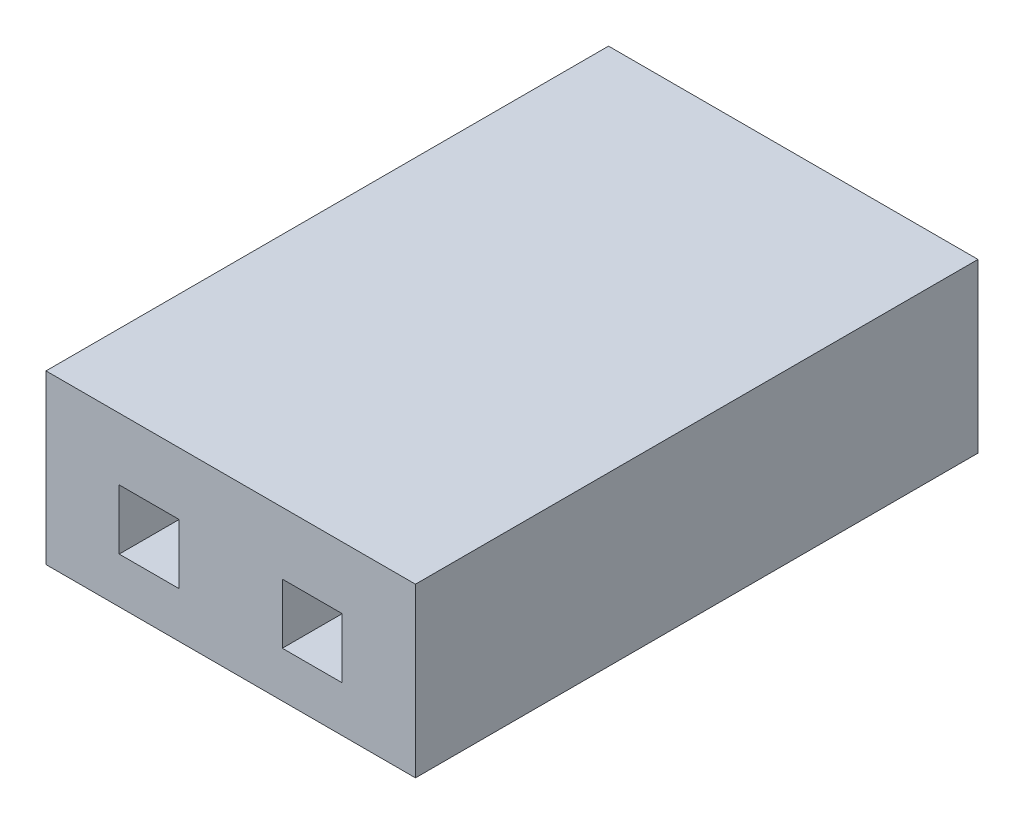
ISO-10303-21;
HEADER;
FILE_DESCRIPTION(('STEP AP214'),'2;1');
FILE_NAME('part.step','',(''),(''),'','','');
FILE_SCHEMA(('AUTOMOTIVE_DESIGN { 1 0 10303 214 1 1 1 1 }'));
ENDSEC;
DATA;
#1=APPLICATION_CONTEXT('core data for automotive mechanical design processes');
#2=APPLICATION_PROTOCOL_DEFINITION('international standard','automotive_design',2000,#1);
#3=PRODUCT_CONTEXT('',#1,'mechanical');
#4=PRODUCT('Part','Part','',(#3));
#5=PRODUCT_RELATED_PRODUCT_CATEGORY('part','',(#4));
#6=PRODUCT_DEFINITION_FORMATION('','',#4);
#7=PRODUCT_DEFINITION_CONTEXT('part definition',#1,'design');
#8=PRODUCT_DEFINITION('design','',#6,#7);
#9=PRODUCT_DEFINITION_SHAPE('','',#8);
#10=(LENGTH_UNIT() NAMED_UNIT(*) SI_UNIT(.MILLI.,.METRE.));
#11=(NAMED_UNIT(*) PLANE_ANGLE_UNIT() SI_UNIT($,.RADIAN.));
#12=(NAMED_UNIT(*) SI_UNIT($,.STERADIAN.) SOLID_ANGLE_UNIT());
#13=UNCERTAINTY_MEASURE_WITH_UNIT(LENGTH_MEASURE(1.E-05),#10,'distance_accuracy_value','');
#14=(GEOMETRIC_REPRESENTATION_CONTEXT(3) GLOBAL_UNCERTAINTY_ASSIGNED_CONTEXT((#13)) GLOBAL_UNIT_ASSIGNED_CONTEXT((#10,
#11,#12)) REPRESENTATION_CONTEXT('',''));
#15=CARTESIAN_POINT('',(0.,0.,0.));
#16=DIRECTION('',(0.,0.,1.));
#17=DIRECTION('',(1.,0.,0.));
#18=AXIS2_PLACEMENT_3D('',#15,#16,#17);
#19=CARTESIAN_POINT('',(2.775,-1.26,8.45));
#20=DIRECTION('',(-1.,0.,0.));
#21=DIRECTION('',(0.,0.,1.));
#22=AXIS2_PLACEMENT_3D('',#19,#20,#21);
#23=PLANE('',#22);
#24=DIRECTION('',(0.,1.,0.));
#25=VECTOR('',#24,1.);
#26=CARTESIAN_POINT('',(2.775,-1.26,0.));
#27=LINE('',#26,#25);
#28=CARTESIAN_POINT('',(2.775,-1.26,0.));
#29=VERTEX_POINT('',#28);
#30=CARTESIAN_POINT('',(2.775,1.26,0.));
#31=VERTEX_POINT('',#30);
#32=EDGE_CURVE('E185',#29,#31,#27,.T.);
#33=ORIENTED_EDGE('',*,*,#32,.T.);
#34=DIRECTION('',(0.,0.,-1.));
#35=VECTOR('',#34,1.);
#36=CARTESIAN_POINT('',(2.775,1.26,8.45));
#37=LINE('',#36,#35);
#38=CARTESIAN_POINT('',(2.775,1.26,8.45));
#39=VERTEX_POINT('',#38);
#40=EDGE_CURVE('E11',#39,#31,#37,.T.);
#41=ORIENTED_EDGE('',*,*,#40,.F.);
#42=DIRECTION('',(0.,1.,0.));
#43=VECTOR('',#42,1.);
#44=CARTESIAN_POINT('',(2.775,-1.26,8.45));
#45=LINE('',#44,#43);
#46=CARTESIAN_POINT('',(2.775,-1.26,8.45));
#47=VERTEX_POINT('',#46);
#48=EDGE_CURVE('E191',#47,#39,#45,.T.);
#49=ORIENTED_EDGE('',*,*,#48,.F.);
#50=DIRECTION('',(0.,0.,-1.));
#51=VECTOR('',#50,1.);
#52=CARTESIAN_POINT('',(2.775,-1.26,8.45));
#53=LINE('',#52,#51);
#54=EDGE_CURVE('E201',#47,#29,#53,.T.);
#55=ORIENTED_EDGE('',*,*,#54,.T.);
#56=EDGE_LOOP('',(#33,#41,#49,#55));
#57=FACE_BOUND('',#56,.T.);
#58=ADVANCED_FACE('F34',(#57),#23,.F.);
#59=CARTESIAN_POINT('',(-2.775,1.26,8.45));
#60=DIRECTION('',(0.,-1.,0.));
#61=DIRECTION('',(0.,0.,-1.));
#62=AXIS2_PLACEMENT_3D('',#59,#60,#61);
#63=PLANE('',#62);
#64=DIRECTION('',(-1.,0.,0.));
#65=VECTOR('',#64,1.);
#66=CARTESIAN_POINT('',(-2.775,1.26,0.));
#67=LINE('',#66,#65);
#68=CARTESIAN_POINT('',(-2.775,1.26,0.));
#69=VERTEX_POINT('',#68);
#70=EDGE_CURVE('E204',#31,#69,#67,.T.);
#71=ORIENTED_EDGE('',*,*,#70,.T.);
#72=DIRECTION('',(0.,0.,-1.));
#73=VECTOR('',#72,1.);
#74=CARTESIAN_POINT('',(-2.775,1.26,8.45));
#75=LINE('',#74,#73);
#76=CARTESIAN_POINT('',(-2.775,1.26,8.45));
#77=VERTEX_POINT('',#76);
#78=EDGE_CURVE('E41',#77,#69,#75,.T.);
#79=ORIENTED_EDGE('',*,*,#78,.F.);
#80=DIRECTION('',(-1.,0.,0.));
#81=VECTOR('',#80,1.);
#82=CARTESIAN_POINT('',(-2.775,1.26,8.45));
#83=LINE('',#82,#81);
#84=EDGE_CURVE('E194',#39,#77,#83,.T.);
#85=ORIENTED_EDGE('',*,*,#84,.F.);
#86=ORIENTED_EDGE('',*,*,#40,.T.);
#87=EDGE_LOOP('',(#71,#79,#85,#86));
#88=FACE_BOUND('',#87,.T.);
#89=ADVANCED_FACE('F234',(#88),#63,.F.);
#90=CARTESIAN_POINT('',(-2.775,-1.26,8.45));
#91=DIRECTION('',(1.,0.,0.));
#92=DIRECTION('',(0.,0.,-1.));
#93=AXIS2_PLACEMENT_3D('',#90,#91,#92);
#94=PLANE('',#93);
#95=DIRECTION('',(0.,-1.,0.));
#96=VECTOR('',#95,1.);
#97=CARTESIAN_POINT('',(-2.775,-1.26,0.));
#98=LINE('',#97,#96);
#99=CARTESIAN_POINT('',(-2.775,-1.26,0.));
#100=VERTEX_POINT('',#99);
#101=EDGE_CURVE('E206',#69,#100,#98,.T.);
#102=ORIENTED_EDGE('',*,*,#101,.T.);
#103=DIRECTION('',(0.,0.,-1.));
#104=VECTOR('',#103,1.);
#105=CARTESIAN_POINT('',(-2.775,-1.26,8.45));
#106=LINE('',#105,#104);
#107=CARTESIAN_POINT('',(-2.775,-1.26,8.45));
#108=VERTEX_POINT('',#107);
#109=EDGE_CURVE('E211',#108,#100,#106,.T.);
#110=ORIENTED_EDGE('',*,*,#109,.F.);
#111=DIRECTION('',(0.,-1.,0.));
#112=VECTOR('',#111,1.);
#113=CARTESIAN_POINT('',(-2.775,-1.26,8.45));
#114=LINE('',#113,#112);
#115=EDGE_CURVE('E197',#77,#108,#114,.T.);
#116=ORIENTED_EDGE('',*,*,#115,.F.);
#117=ORIENTED_EDGE('',*,*,#78,.T.);
#118=EDGE_LOOP('',(#102,#110,#116,#117));
#119=FACE_BOUND('',#118,.T.);
#120=ADVANCED_FACE('F218',(#119),#94,.F.);
#121=CARTESIAN_POINT('',(-2.775,-1.26,8.45));
#122=DIRECTION('',(0.,1.,0.));
#123=DIRECTION('',(0.,0.,1.));
#124=AXIS2_PLACEMENT_3D('',#121,#122,#123);
#125=PLANE('',#124);
#126=DIRECTION('',(1.,0.,0.));
#127=VECTOR('',#126,1.);
#128=CARTESIAN_POINT('',(-2.775,-1.26,0.));
#129=LINE('',#128,#127);
#130=EDGE_CURVE('E195',#100,#29,#129,.T.);
#131=ORIENTED_EDGE('',*,*,#130,.T.);
#132=ORIENTED_EDGE('',*,*,#54,.F.);
#133=DIRECTION('',(1.,0.,0.));
#134=VECTOR('',#133,1.);
#135=CARTESIAN_POINT('',(-2.775,-1.26,8.45));
#136=LINE('',#135,#134);
#137=EDGE_CURVE('E199',#108,#47,#136,.T.);
#138=ORIENTED_EDGE('',*,*,#137,.F.);
#139=ORIENTED_EDGE('',*,*,#109,.T.);
#140=EDGE_LOOP('',(#131,#132,#138,#139));
#141=FACE_BOUND('',#140,.T.);
#142=ADVANCED_FACE('F227',(#141),#125,.F.);
#143=CARTESIAN_POINT('',(0.,0.,8.45));
#144=DIRECTION('',(0.,0.,-1.));
#145=DIRECTION('',(-1.,0.,0.));
#146=AXIS2_PLACEMENT_3D('',#143,#144,#145);
#147=PLANE('',#146);
#148=DIRECTION('',(-1.,0.,0.));
#149=VECTOR('',#148,1.);
#150=CARTESIAN_POINT('',(-1.675,0.326600635830232,8.45));
#151=LINE('',#150,#149);
#152=CARTESIAN_POINT('',(-0.774999999999999,0.326600635830232,8.45));
#153=VERTEX_POINT('',#152);
#154=CARTESIAN_POINT('',(-1.675,0.326600635830232,8.45));
#155=VERTEX_POINT('',#154);
#156=EDGE_CURVE('E151',#153,#155,#151,.T.);
#157=ORIENTED_EDGE('',*,*,#156,.F.);
#158=DIRECTION('',(0.,1.,0.));
#159=VECTOR('',#158,1.);
#160=CARTESIAN_POINT('',(-0.774999999999999,-0.573399364169768,8.45));
#161=LINE('',#160,#159);
#162=CARTESIAN_POINT('',(-0.774999999999999,-0.573399364169768,8.45));
#163=VERTEX_POINT('',#162);
#164=EDGE_CURVE('E48',#163,#153,#161,.T.);
#165=ORIENTED_EDGE('',*,*,#164,.F.);
#166=DIRECTION('',(1.,0.,0.));
#167=VECTOR('',#166,1.);
#168=CARTESIAN_POINT('',(-1.675,-0.573399364169768,8.45));
#169=LINE('',#168,#167);
#170=CARTESIAN_POINT('',(-1.675,-0.573399364169768,8.45));
#171=VERTEX_POINT('',#170);
#172=EDGE_CURVE('E142',#171,#163,#169,.T.);
#173=ORIENTED_EDGE('',*,*,#172,.F.);
#174=DIRECTION('',(0.,-1.,0.));
#175=VECTOR('',#174,1.);
#176=CARTESIAN_POINT('',(-1.675,-0.573399364169768,8.45));
#177=LINE('',#176,#175);
#178=EDGE_CURVE('E145',#155,#171,#177,.T.);
#179=ORIENTED_EDGE('',*,*,#178,.F.);
#180=EDGE_LOOP('',(#157,#165,#173,#179));
#181=FACE_BOUND('',#180,.T.);
#182=DIRECTION('',(-1.,0.,0.));
#183=VECTOR('',#182,1.);
#184=CARTESIAN_POINT('',(0.775000000000001,0.326600635830232,8.45));
#185=LINE('',#184,#183);
#186=CARTESIAN_POINT('',(1.675,0.326600635830232,8.45));
#187=VERTEX_POINT('',#186);
#188=CARTESIAN_POINT('',(0.775000000000001,0.326600635830232,8.45));
#189=VERTEX_POINT('',#188);
#190=EDGE_CURVE('E175',#187,#189,#185,.T.);
#191=ORIENTED_EDGE('',*,*,#190,.F.);
#192=DIRECTION('',(0.,1.,0.));
#193=VECTOR('',#192,1.);
#194=CARTESIAN_POINT('',(1.675,-0.573399364169768,8.45));
#195=LINE('',#194,#193);
#196=CARTESIAN_POINT('',(1.675,-0.573399364169768,8.45));
#197=VERTEX_POINT('',#196);
#198=EDGE_CURVE('E56',#197,#187,#195,.T.);
#199=ORIENTED_EDGE('',*,*,#198,.F.);
#200=DIRECTION('',(1.,0.,0.));
#201=VECTOR('',#200,1.);
#202=CARTESIAN_POINT('',(0.775000000000001,-0.573399364169768,8.45));
#203=LINE('',#202,#201);
#204=CARTESIAN_POINT('',(0.775000000000001,-0.573399364169768,8.45));
#205=VERTEX_POINT('',#204);
#206=EDGE_CURVE('E164',#205,#197,#203,.T.);
#207=ORIENTED_EDGE('',*,*,#206,.F.);
#208=DIRECTION('',(0.,-1.,0.));
#209=VECTOR('',#208,1.);
#210=CARTESIAN_POINT('',(0.775000000000001,-0.573399364169768,8.45));
#211=LINE('',#210,#209);
#212=EDGE_CURVE('E178',#189,#205,#211,.T.);
#213=ORIENTED_EDGE('',*,*,#212,.F.);
#214=EDGE_LOOP('',(#191,#199,#207,#213));
#215=FACE_BOUND('',#214,.T.);
#216=ORIENTED_EDGE('',*,*,#48,.T.);
#217=ORIENTED_EDGE('',*,*,#84,.T.);
#218=ORIENTED_EDGE('',*,*,#115,.T.);
#219=ORIENTED_EDGE('',*,*,#137,.T.);
#220=EDGE_LOOP('',(#216,#217,#218,#219));
#221=FACE_BOUND('',#220,.T.);
#222=ADVANCED_FACE('F233',(#181,#215,#221),#147,.F.);
#223=CARTESIAN_POINT('',(0.,0.,0.));
#224=DIRECTION('',(0.,0.,-1.));
#225=DIRECTION('',(-1.,0.,0.));
#226=AXIS2_PLACEMENT_3D('',#223,#224,#225);
#227=PLANE('',#226);
#228=ORIENTED_EDGE('',*,*,#32,.F.);
#229=ORIENTED_EDGE('',*,*,#130,.F.);
#230=ORIENTED_EDGE('',*,*,#101,.F.);
#231=ORIENTED_EDGE('',*,*,#70,.F.);
#232=EDGE_LOOP('',(#228,#229,#230,#231));
#233=FACE_BOUND('',#232,.T.);
#234=ADVANCED_FACE('F224',(#233),#227,.T.);
#235=CARTESIAN_POINT('',(1.675,-0.573399364169768,1.01772657964696));
#236=DIRECTION('',(1.,0.,0.));
#237=DIRECTION('',(0.,0.,-1.));
#238=AXIS2_PLACEMENT_3D('',#235,#236,#237);
#239=PLANE('',#238);
#240=ORIENTED_EDGE('',*,*,#198,.T.);
#241=DIRECTION('',(0.,0.,1.));
#242=VECTOR('',#241,1.);
#243=CARTESIAN_POINT('',(1.675,0.326600635830232,1.01772657964696));
#244=LINE('',#243,#242);
#245=CARTESIAN_POINT('',(1.675,0.326600635830232,1.01772657964696));
#246=VERTEX_POINT('',#245);
#247=EDGE_CURVE('E173',#246,#187,#244,.T.);
#248=ORIENTED_EDGE('',*,*,#247,.F.);
#249=DIRECTION('',(0.,1.,0.));
#250=VECTOR('',#249,1.);
#251=CARTESIAN_POINT('',(1.675,-0.573399364169768,1.01772657964696));
#252=LINE('',#251,#250);
#253=CARTESIAN_POINT('',(1.675,-0.573399364169768,1.01772657964696));
#254=VERTEX_POINT('',#253);
#255=EDGE_CURVE('E160',#254,#246,#252,.T.);
#256=ORIENTED_EDGE('',*,*,#255,.F.);
#257=DIRECTION('',(0.,0.,1.));
#258=VECTOR('',#257,1.);
#259=CARTESIAN_POINT('',(1.675,-0.573399364169768,1.01772657964696));
#260=LINE('',#259,#258);
#261=EDGE_CURVE('E183',#254,#197,#260,.T.);
#262=ORIENTED_EDGE('',*,*,#261,.T.);
#263=EDGE_LOOP('',(#240,#248,#256,#262));
#264=FACE_BOUND('',#263,.T.);
#265=ADVANCED_FACE('F246',(#264),#239,.F.);
#266=CARTESIAN_POINT('',(0.775000000000001,-0.573399364169768,1.01772657964696));
#267=DIRECTION('',(0.,-1.,0.));
#268=DIRECTION('',(0.,0.,-1.));
#269=AXIS2_PLACEMENT_3D('',#266,#267,#268);
#270=PLANE('',#269);
#271=ORIENTED_EDGE('',*,*,#206,.T.);
#272=ORIENTED_EDGE('',*,*,#261,.F.);
#273=DIRECTION('',(1.,0.,0.));
#274=VECTOR('',#273,1.);
#275=CARTESIAN_POINT('',(0.775000000000001,-0.573399364169768,1.01772657964696));
#276=LINE('',#275,#274);
#277=CARTESIAN_POINT('',(0.775000000000001,-0.573399364169768,1.01772657964696));
#278=VERTEX_POINT('',#277);
#279=EDGE_CURVE('E170',#278,#254,#276,.T.);
#280=ORIENTED_EDGE('',*,*,#279,.F.);
#281=DIRECTION('',(0.,0.,1.));
#282=VECTOR('',#281,1.);
#283=CARTESIAN_POINT('',(0.775000000000001,-0.573399364169768,1.01772657964696));
#284=LINE('',#283,#282);
#285=EDGE_CURVE('E186',#278,#205,#284,.T.);
#286=ORIENTED_EDGE('',*,*,#285,.T.);
#287=EDGE_LOOP('',(#271,#272,#280,#286));
#288=FACE_BOUND('',#287,.T.);
#289=ADVANCED_FACE('F252',(#288),#270,.F.);
#290=CARTESIAN_POINT('',(0.775000000000001,-0.573399364169768,1.01772657964696));
#291=DIRECTION('',(-1.,0.,0.));
#292=DIRECTION('',(0.,0.,1.));
#293=AXIS2_PLACEMENT_3D('',#290,#291,#292);
#294=PLANE('',#293);
#295=ORIENTED_EDGE('',*,*,#212,.T.);
#296=ORIENTED_EDGE('',*,*,#285,.F.);
#297=DIRECTION('',(0.,-1.,0.));
#298=VECTOR('',#297,1.);
#299=CARTESIAN_POINT('',(0.775000000000001,-0.573399364169768,1.01772657964696));
#300=LINE('',#299,#298);
#301=CARTESIAN_POINT('',(0.775000000000001,0.326600635830232,1.01772657964696));
#302=VERTEX_POINT('',#301);
#303=EDGE_CURVE('E167',#302,#278,#300,.T.);
#304=ORIENTED_EDGE('',*,*,#303,.F.);
#305=DIRECTION('',(0.,0.,1.));
#306=VECTOR('',#305,1.);
#307=CARTESIAN_POINT('',(0.775000000000001,0.326600635830232,1.01772657964696));
#308=LINE('',#307,#306);
#309=EDGE_CURVE('E188',#302,#189,#308,.T.);
#310=ORIENTED_EDGE('',*,*,#309,.T.);
#311=EDGE_LOOP('',(#295,#296,#304,#310));
#312=FACE_BOUND('',#311,.T.);
#313=ADVANCED_FACE('F257',(#312),#294,.F.);
#314=CARTESIAN_POINT('',(0.775000000000001,0.326600635830232,1.01772657964696));
#315=DIRECTION('',(0.,1.,0.));
#316=DIRECTION('',(0.,0.,1.));
#317=AXIS2_PLACEMENT_3D('',#314,#315,#316);
#318=PLANE('',#317);
#319=ORIENTED_EDGE('',*,*,#190,.T.);
#320=ORIENTED_EDGE('',*,*,#309,.F.);
#321=DIRECTION('',(-1.,0.,0.));
#322=VECTOR('',#321,1.);
#323=CARTESIAN_POINT('',(0.775000000000001,0.326600635830232,1.01772657964696));
#324=LINE('',#323,#322);
#325=EDGE_CURVE('E163',#246,#302,#324,.T.);
#326=ORIENTED_EDGE('',*,*,#325,.F.);
#327=ORIENTED_EDGE('',*,*,#247,.T.);
#328=EDGE_LOOP('',(#319,#320,#326,#327));
#329=FACE_BOUND('',#328,.T.);
#330=ADVANCED_FACE('F253',(#329),#318,.F.);
#331=CARTESIAN_POINT('',(0.,0.,1.01772657964696));
#332=DIRECTION('',(0.,0.,-1.));
#333=DIRECTION('',(-1.,0.,0.));
#334=AXIS2_PLACEMENT_3D('',#331,#332,#333);
#335=PLANE('',#334);
#336=ORIENTED_EDGE('',*,*,#255,.T.);
#337=ORIENTED_EDGE('',*,*,#325,.T.);
#338=ORIENTED_EDGE('',*,*,#303,.T.);
#339=ORIENTED_EDGE('',*,*,#279,.T.);
#340=EDGE_LOOP('',(#336,#337,#338,#339));
#341=FACE_BOUND('',#340,.T.);
#342=ADVANCED_FACE('F256',(#341),#335,.F.);
#343=CARTESIAN_POINT('',(-0.774999999999999,-0.573399364169768,1.01772657964696));
#344=DIRECTION('',(1.,0.,0.));
#345=DIRECTION('',(0.,0.,-1.));
#346=AXIS2_PLACEMENT_3D('',#343,#344,#345);
#347=PLANE('',#346);
#348=ORIENTED_EDGE('',*,*,#164,.T.);
#349=DIRECTION('',(0.,0.,1.));
#350=VECTOR('',#349,1.);
#351=CARTESIAN_POINT('',(-0.774999999999999,0.326600635830232,1.01772657964696));
#352=LINE('',#351,#350);
#353=CARTESIAN_POINT('',(-0.774999999999999,0.326600635830232,1.01772657964696));
#354=VERTEX_POINT('',#353);
#355=EDGE_CURVE('E120',#354,#153,#352,.T.);
#356=ORIENTED_EDGE('',*,*,#355,.F.);
#357=DIRECTION('',(0.,1.,0.));
#358=VECTOR('',#357,1.);
#359=CARTESIAN_POINT('',(-0.774999999999999,-0.573399364169768,1.01772657964696));
#360=LINE('',#359,#358);
#361=CARTESIAN_POINT('',(-0.774999999999999,-0.573399364169768,1.01772657964696));
#362=VERTEX_POINT('',#361);
#363=EDGE_CURVE('E124',#362,#354,#360,.T.);
#364=ORIENTED_EDGE('',*,*,#363,.F.);
#365=DIRECTION('',(0.,0.,1.));
#366=VECTOR('',#365,1.);
#367=CARTESIAN_POINT('',(-0.774999999999999,-0.573399364169768,1.01772657964696));
#368=LINE('',#367,#366);
#369=EDGE_CURVE('E155',#362,#163,#368,.T.);
#370=ORIENTED_EDGE('',*,*,#369,.T.);
#371=EDGE_LOOP('',(#348,#356,#364,#370));
#372=FACE_BOUND('',#371,.T.);
#373=ADVANCED_FACE('F122',(#372),#347,.F.);
#374=CARTESIAN_POINT('',(-1.675,-0.573399364169768,1.01772657964696));
#375=DIRECTION('',(0.,-1.,0.));
#376=DIRECTION('',(0.,0.,-1.));
#377=AXIS2_PLACEMENT_3D('',#374,#375,#376);
#378=PLANE('',#377);
#379=ORIENTED_EDGE('',*,*,#172,.T.);
#380=ORIENTED_EDGE('',*,*,#369,.F.);
#381=DIRECTION('',(1.,0.,0.));
#382=VECTOR('',#381,1.);
#383=CARTESIAN_POINT('',(-1.675,-0.573399364169768,1.01772657964696));
#384=LINE('',#383,#382);
#385=CARTESIAN_POINT('',(-1.675,-0.573399364169768,1.01772657964696));
#386=VERTEX_POINT('',#385);
#387=EDGE_CURVE('E130',#386,#362,#384,.T.);
#388=ORIENTED_EDGE('',*,*,#387,.F.);
#389=DIRECTION('',(0.,0.,1.));
#390=VECTOR('',#389,1.);
#391=CARTESIAN_POINT('',(-1.675,-0.573399364169768,1.01772657964696));
#392=LINE('',#391,#390);
#393=EDGE_CURVE('E157',#386,#171,#392,.T.);
#394=ORIENTED_EDGE('',*,*,#393,.T.);
#395=EDGE_LOOP('',(#379,#380,#388,#394));
#396=FACE_BOUND('',#395,.T.);
#397=ADVANCED_FACE('F270',(#396),#378,.F.);
#398=CARTESIAN_POINT('',(-1.675,-0.573399364169768,1.01772657964696));
#399=DIRECTION('',(-1.,0.,0.));
#400=DIRECTION('',(0.,0.,1.));
#401=AXIS2_PLACEMENT_3D('',#398,#399,#400);
#402=PLANE('',#401);
#403=ORIENTED_EDGE('',*,*,#178,.T.);
#404=ORIENTED_EDGE('',*,*,#393,.F.);
#405=DIRECTION('',(0.,-1.,0.));
#406=VECTOR('',#405,1.);
#407=CARTESIAN_POINT('',(-1.675,-0.573399364169768,1.01772657964696));
#408=LINE('',#407,#406);
#409=CARTESIAN_POINT('',(-1.675,0.326600635830232,1.01772657964696));
#410=VERTEX_POINT('',#409);
#411=EDGE_CURVE('E138',#410,#386,#408,.T.);
#412=ORIENTED_EDGE('',*,*,#411,.F.);
#413=DIRECTION('',(0.,0.,1.));
#414=VECTOR('',#413,1.);
#415=CARTESIAN_POINT('',(-1.675,0.326600635830232,1.01772657964696));
#416=LINE('',#415,#414);
#417=EDGE_CURVE('E129',#410,#155,#416,.T.);
#418=ORIENTED_EDGE('',*,*,#417,.T.);
#419=EDGE_LOOP('',(#403,#404,#412,#418));
#420=FACE_BOUND('',#419,.T.);
#421=ADVANCED_FACE('F273',(#420),#402,.F.);
#422=CARTESIAN_POINT('',(-1.675,0.326600635830232,1.01772657964696));
#423=DIRECTION('',(0.,1.,0.));
#424=DIRECTION('',(0.,0.,1.));
#425=AXIS2_PLACEMENT_3D('',#422,#423,#424);
#426=PLANE('',#425);
#427=ORIENTED_EDGE('',*,*,#156,.T.);
#428=ORIENTED_EDGE('',*,*,#417,.F.);
#429=DIRECTION('',(-1.,0.,0.));
#430=VECTOR('',#429,1.);
#431=CARTESIAN_POINT('',(-1.675,0.326600635830232,1.01772657964696));
#432=LINE('',#431,#430);
#433=EDGE_CURVE('E133',#354,#410,#432,.T.);
#434=ORIENTED_EDGE('',*,*,#433,.F.);
#435=ORIENTED_EDGE('',*,*,#355,.T.);
#436=EDGE_LOOP('',(#427,#428,#434,#435));
#437=FACE_BOUND('',#436,.T.);
#438=ADVANCED_FACE('F134',(#437),#426,.F.);
#439=CARTESIAN_POINT('',(0.,0.,1.01772657964696));
#440=DIRECTION('',(0.,0.,-1.));
#441=DIRECTION('',(-1.,0.,0.));
#442=AXIS2_PLACEMENT_3D('',#439,#440,#441);
#443=PLANE('',#442);
#444=ORIENTED_EDGE('',*,*,#363,.T.);
#445=ORIENTED_EDGE('',*,*,#433,.T.);
#446=ORIENTED_EDGE('',*,*,#411,.T.);
#447=ORIENTED_EDGE('',*,*,#387,.T.);
#448=EDGE_LOOP('',(#444,#445,#446,#447));
#449=FACE_BOUND('',#448,.T.);
#450=ADVANCED_FACE('F140',(#449),#443,.F.);
#451=CLOSED_SHELL('',(#58,#89,#120,#142,#222,#234,#265,#289,#313,#330,#342,#373,#397,#421,#438,#450));
#452=MANIFOLD_SOLID_BREP('B2',#451);
#453=ADVANCED_BREP_SHAPE_REPRESENTATION('',(#18,#452),#14);
#454=SHAPE_DEFINITION_REPRESENTATION(#9,#453);
ENDSEC;
END-ISO-10303-21;
